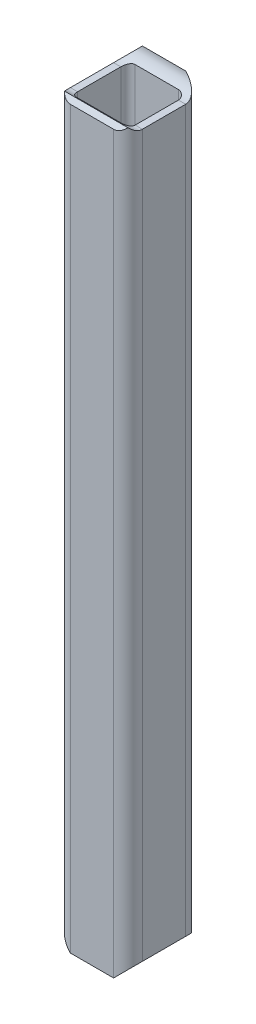
ISO-10303-21;
HEADER;
FILE_DESCRIPTION(('STEP AP214'),'2;1');
FILE_NAME('part.step','',(''),(''),'','','');
FILE_SCHEMA(('AUTOMOTIVE_DESIGN { 1 0 10303 214 1 1 1 1 }'));
ENDSEC;
DATA;
#1=APPLICATION_CONTEXT('core data for automotive mechanical design processes');
#2=APPLICATION_PROTOCOL_DEFINITION('international standard','automotive_design',2000,#1);
#3=PRODUCT_CONTEXT('',#1,'mechanical');
#4=PRODUCT('Part','Part','',(#3));
#5=PRODUCT_RELATED_PRODUCT_CATEGORY('part','',(#4));
#6=PRODUCT_DEFINITION_FORMATION('','',#4);
#7=PRODUCT_DEFINITION_CONTEXT('part definition',#1,'design');
#8=PRODUCT_DEFINITION('design','',#6,#7);
#9=PRODUCT_DEFINITION_SHAPE('','',#8);
#10=(LENGTH_UNIT() NAMED_UNIT(*) SI_UNIT(.MILLI.,.METRE.));
#11=(NAMED_UNIT(*) PLANE_ANGLE_UNIT() SI_UNIT($,.RADIAN.));
#12=(NAMED_UNIT(*) SI_UNIT($,.STERADIAN.) SOLID_ANGLE_UNIT());
#13=UNCERTAINTY_MEASURE_WITH_UNIT(LENGTH_MEASURE(1.E-05),#10,'distance_accuracy_value','');
#14=(GEOMETRIC_REPRESENTATION_CONTEXT(3) GLOBAL_UNCERTAINTY_ASSIGNED_CONTEXT((#13)) GLOBAL_UNIT_ASSIGNED_CONTEXT((#10,
#11,#12)) REPRESENTATION_CONTEXT('',''));
#15=CARTESIAN_POINT('',(0.,0.,0.));
#16=DIRECTION('',(0.,0.,1.));
#17=DIRECTION('',(1.,0.,0.));
#18=AXIS2_PLACEMENT_3D('',#15,#16,#17);
#19=CARTESIAN_POINT('',(5.99999999999992,1.94289029309402E-13,-2294.));
#20=DIRECTION('',(0.,1.,0.));
#21=DIRECTION('',(-1.,0.,0.));
#22=AXIS2_PLACEMENT_3D('',#19,#20,#21);
#23=CYLINDRICAL_SURFACE('',#22,4.);
#24=CARTESIAN_POINT('',(5.99999999999995,214.,-2294.));
#25=DIRECTION('',(0.707106781186548,0.707106781186547,0.));
#26=DIRECTION('',(-0.707106781186547,0.707106781186548,0.));
#27=AXIS2_PLACEMENT_3D('',#24,#25,#26);
#28=ELLIPSE('',#27,5.65685424949238,4.);
#29=CARTESIAN_POINT('',(8.82842712474652,211.171572875254,-2291.17157287525));
#30=VERTEX_POINT('',#29);
#31=CARTESIAN_POINT('',(9.99999999999995,210.,-2294.));
#32=VERTEX_POINT('',#31);
#33=EDGE_CURVE('E119',#30,#32,#28,.T.);
#34=ORIENTED_EDGE('',*,*,#33,.F.);
#35=CARTESIAN_POINT('',(5.99999999999995,214.,-2294.));
#36=DIRECTION('',(0.,0.707106781186548,0.707106781186548));
#37=DIRECTION('',(0.,0.707106781186548,-0.707106781186548));
#38=AXIS2_PLACEMENT_3D('',#35,#36,#37);
#39=ELLIPSE('',#38,5.65685424949238,4.);
#40=CARTESIAN_POINT('',(5.99999999999995,210.,-2290.));
#41=VERTEX_POINT('',#40);
#42=EDGE_CURVE('E173',#41,#30,#39,.T.);
#43=ORIENTED_EDGE('',*,*,#42,.F.);
#44=DIRECTION('',(0.,1.,0.));
#45=VECTOR('',#44,1.);
#46=CARTESIAN_POINT('',(5.99999999999992,1.94289029309402E-13,-2290.));
#47=LINE('',#46,#45);
#48=CARTESIAN_POINT('',(5.99999999999987,6.00000000000001,-2290.));
#49=VERTEX_POINT('',#48);
#50=EDGE_CURVE('E139',#49,#41,#47,.T.);
#51=ORIENTED_EDGE('',*,*,#50,.F.);
#52=CARTESIAN_POINT('',(5.99999999999992,6.00000000000001,-2294.));
#53=DIRECTION('',(-0.707106781186547,0.707106781186548,0.));
#54=DIRECTION('',(0.707106781186548,0.707106781186547,0.));
#55=AXIS2_PLACEMENT_3D('',#52,#53,#54);
#56=ELLIPSE('',#55,5.65685424949239,4.);
#57=CARTESIAN_POINT('',(9.99999999999993,10.,-2294.));
#58=VERTEX_POINT('',#57);
#59=EDGE_CURVE('E182',#58,#49,#56,.F.);
#60=ORIENTED_EDGE('',*,*,#59,.F.);
#61=DIRECTION('',(0.,1.,0.));
#62=VECTOR('',#61,1.);
#63=CARTESIAN_POINT('',(9.99999999999993,1.94289029309402E-13,-2294.));
#64=LINE('',#63,#62);
#65=EDGE_CURVE('E345',#58,#32,#64,.T.);
#66=ORIENTED_EDGE('',*,*,#65,.T.);
#67=EDGE_LOOP('',(#34,#43,#51,#60,#66));
#68=FACE_BOUND('',#67,.T.);
#69=ADVANCED_FACE('F41',(#68),#23,.T.);
#70=CARTESIAN_POINT('',(-6.00000000000006,1.94289029309402E-13,-2294.));
#71=DIRECTION('',(0.,1.,0.));
#72=DIRECTION('',(-1.,0.,0.));
#73=AXIS2_PLACEMENT_3D('',#70,#71,#72);
#74=CYLINDRICAL_SURFACE('',#73,4.);
#75=CARTESIAN_POINT('',(-6.00000000000005,214.,-2294.));
#76=DIRECTION('',(-0.707106781186547,0.707106781186548,0.));
#77=DIRECTION('',(0.707106781186548,0.707106781186547,0.));
#78=AXIS2_PLACEMENT_3D('',#75,#76,#77);
#79=ELLIPSE('',#78,5.65685424949239,4.);
#80=CARTESIAN_POINT('',(-10.0000000000001,210.,-2294.));
#81=VERTEX_POINT('',#80);
#82=CARTESIAN_POINT('',(-8.82842712474652,211.171572875254,-2291.17157287525));
#83=VERTEX_POINT('',#82);
#84=EDGE_CURVE('E440',#81,#83,#79,.T.);
#85=ORIENTED_EDGE('',*,*,#84,.F.);
#86=DIRECTION('',(0.,1.,0.));
#87=VECTOR('',#86,1.);
#88=CARTESIAN_POINT('',(-10.0000000000001,1.94289029309402E-13,-2294.));
#89=LINE('',#88,#87);
#90=CARTESIAN_POINT('',(-10.0000000000001,10.,-2294.));
#91=VERTEX_POINT('',#90);
#92=EDGE_CURVE('E136',#91,#81,#89,.T.);
#93=ORIENTED_EDGE('',*,*,#92,.F.);
#94=CARTESIAN_POINT('',(-6.00000000000006,6.00000000000001,-2294.));
#95=DIRECTION('',(0.707106781186548,0.707106781186547,0.));
#96=DIRECTION('',(-0.707106781186547,0.707106781186548,0.));
#97=AXIS2_PLACEMENT_3D('',#94,#95,#96);
#98=ELLIPSE('',#97,5.65685424949238,4.);
#99=CARTESIAN_POINT('',(-6.00000000000006,6.00000000000001,-2290.));
#100=VERTEX_POINT('',#99);
#101=EDGE_CURVE('E185',#100,#91,#98,.F.);
#102=ORIENTED_EDGE('',*,*,#101,.F.);
#103=DIRECTION('',(0.,1.,0.));
#104=VECTOR('',#103,1.);
#105=CARTESIAN_POINT('',(-6.00000000000006,1.94289029309402E-13,-2290.));
#106=LINE('',#105,#104);
#107=CARTESIAN_POINT('',(-6.00000000000003,210.,-2290.));
#108=VERTEX_POINT('',#107);
#109=EDGE_CURVE('E360',#100,#108,#106,.T.);
#110=ORIENTED_EDGE('',*,*,#109,.T.);
#111=CARTESIAN_POINT('',(-6.00000000000003,214.,-2294.));
#112=DIRECTION('',(0.,0.707106781186548,0.707106781186548));
#113=DIRECTION('',(0.,0.707106781186548,-0.707106781186548));
#114=AXIS2_PLACEMENT_3D('',#111,#112,#113);
#115=ELLIPSE('',#114,5.65685424949238,4.);
#116=EDGE_CURVE('E165',#83,#108,#115,.T.);
#117=ORIENTED_EDGE('',*,*,#116,.F.);
#118=EDGE_LOOP('',(#85,#93,#102,#110,#117));
#119=FACE_BOUND('',#118,.T.);
#120=ADVANCED_FACE('F445',(#119),#74,.T.);
#121=CARTESIAN_POINT('',(-6.00000000000006,1.94289029309402E-13,-2306.));
#122=DIRECTION('',(0.,1.,0.));
#123=DIRECTION('',(-1.,0.,0.));
#124=AXIS2_PLACEMENT_3D('',#121,#122,#123);
#125=CYLINDRICAL_SURFACE('',#124,4.);
#126=CARTESIAN_POINT('',(-6.00000000000005,214.,-2306.));
#127=DIRECTION('',(-0.707106781186547,0.707106781186548,0.));
#128=DIRECTION('',(0.707106781186548,0.707106781186547,0.));
#129=AXIS2_PLACEMENT_3D('',#126,#127,#128);
#130=ELLIPSE('',#129,5.65685424949239,4.);
#131=CARTESIAN_POINT('',(-6.00000000000006,214.,-2310.));
#132=VERTEX_POINT('',#131);
#133=CARTESIAN_POINT('',(-10.,210.,-2306.));
#134=VERTEX_POINT('',#133);
#135=EDGE_CURVE('E320',#132,#134,#130,.T.);
#136=ORIENTED_EDGE('',*,*,#135,.F.);
#137=DIRECTION('',(0.,1.,0.));
#138=VECTOR('',#137,1.);
#139=CARTESIAN_POINT('',(-6.00000000000006,1.94289029309402E-13,-2310.));
#140=LINE('',#139,#138);
#141=CARTESIAN_POINT('',(-6.00000000000012,6.00000000000001,-2310.));
#142=VERTEX_POINT('',#141);
#143=EDGE_CURVE('E163',#142,#132,#140,.T.);
#144=ORIENTED_EDGE('',*,*,#143,.F.);
#145=CARTESIAN_POINT('',(-6.00000000000006,6.00000000000001,-2306.));
#146=DIRECTION('',(0.707106781186548,0.707106781186547,0.));
#147=DIRECTION('',(-0.707106781186547,0.707106781186548,0.));
#148=AXIS2_PLACEMENT_3D('',#145,#146,#147);
#149=ELLIPSE('',#148,5.65685424949238,4.);
#150=CARTESIAN_POINT('',(-10.0000000000001,10.,-2306.));
#151=VERTEX_POINT('',#150);
#152=EDGE_CURVE('E180',#151,#142,#149,.F.);
#153=ORIENTED_EDGE('',*,*,#152,.F.);
#154=DIRECTION('',(0.,1.,0.));
#155=VECTOR('',#154,1.);
#156=CARTESIAN_POINT('',(-10.0000000000001,1.94289029309402E-13,-2306.));
#157=LINE('',#156,#155);
#158=EDGE_CURVE('E364',#151,#134,#157,.T.);
#159=ORIENTED_EDGE('',*,*,#158,.T.);
#160=EDGE_LOOP('',(#136,#144,#153,#159));
#161=FACE_BOUND('',#160,.T.);
#162=ADVANCED_FACE('F43',(#161),#125,.T.);
#163=CARTESIAN_POINT('',(5.99999999999998,1.94289029309402E-13,-2306.));
#164=DIRECTION('',(0.,1.,0.));
#165=DIRECTION('',(-1.,0.,0.));
#166=AXIS2_PLACEMENT_3D('',#163,#164,#165);
#167=CYLINDRICAL_SURFACE('',#166,4.);
#168=CARTESIAN_POINT('',(6.00000000000001,214.,-2306.));
#169=DIRECTION('',(0.707106781186548,0.707106781186547,0.));
#170=DIRECTION('',(-0.707106781186547,0.707106781186548,0.));
#171=AXIS2_PLACEMENT_3D('',#168,#169,#170);
#172=ELLIPSE('',#171,5.65685424949238,4.);
#173=CARTESIAN_POINT('',(9.99999999999995,210.,-2306.));
#174=VERTEX_POINT('',#173);
#175=CARTESIAN_POINT('',(6.00000000000001,214.,-2310.));
#176=VERTEX_POINT('',#175);
#177=EDGE_CURVE('E283',#174,#176,#172,.T.);
#178=ORIENTED_EDGE('',*,*,#177,.F.);
#179=DIRECTION('',(0.,1.,0.));
#180=VECTOR('',#179,1.);
#181=CARTESIAN_POINT('',(9.99999999999998,1.94289029309402E-13,-2306.));
#182=LINE('',#181,#180);
#183=CARTESIAN_POINT('',(9.99999999999993,10.,-2306.));
#184=VERTEX_POINT('',#183);
#185=EDGE_CURVE('E160',#184,#174,#182,.T.);
#186=ORIENTED_EDGE('',*,*,#185,.F.);
#187=CARTESIAN_POINT('',(5.99999999999998,6.00000000000001,-2306.));
#188=DIRECTION('',(-0.707106781186547,0.707106781186548,0.));
#189=DIRECTION('',(0.707106781186548,0.707106781186547,0.));
#190=AXIS2_PLACEMENT_3D('',#187,#188,#189);
#191=ELLIPSE('',#190,5.65685424949239,4.);
#192=CARTESIAN_POINT('',(5.99999999999998,6.00000000000001,-2310.));
#193=VERTEX_POINT('',#192);
#194=EDGE_CURVE('E298',#193,#184,#191,.F.);
#195=ORIENTED_EDGE('',*,*,#194,.F.);
#196=DIRECTION('',(0.,1.,0.));
#197=VECTOR('',#196,1.);
#198=CARTESIAN_POINT('',(5.99999999999998,1.94289029309402E-13,-2310.));
#199=LINE('',#198,#197);
#200=EDGE_CURVE('E45',#193,#176,#199,.T.);
#201=ORIENTED_EDGE('',*,*,#200,.T.);
#202=EDGE_LOOP('',(#178,#186,#195,#201));
#203=FACE_BOUND('',#202,.T.);
#204=ADVANCED_FACE('F349',(#203),#167,.T.);
#205=CARTESIAN_POINT('',(-6.00000000000006,1.94289029309402E-13,-2294.));
#206=DIRECTION('',(0.,1.,0.));
#207=DIRECTION('',(-1.,0.,0.));
#208=AXIS2_PLACEMENT_3D('',#205,#206,#207);
#209=CYLINDRICAL_SURFACE('',#208,2.);
#210=DIRECTION('',(0.,1.,0.));
#211=VECTOR('',#210,1.);
#212=CARTESIAN_POINT('',(-8.00000000000006,1.94289029309402E-13,-2294.));
#213=LINE('',#212,#211);
#214=CARTESIAN_POINT('',(-8.00000000000006,10.,-2294.));
#215=VERTEX_POINT('',#214);
#216=CARTESIAN_POINT('',(-8.00000000000004,210.,-2294.));
#217=VERTEX_POINT('',#216);
#218=EDGE_CURVE('E259',#215,#217,#213,.T.);
#219=ORIENTED_EDGE('',*,*,#218,.T.);
#220=CARTESIAN_POINT('',(-8.00000000000004,210.,-2294.));
#221=CARTESIAN_POINT('',(-8.00000848506605,209.999990627617,-2293.94720265964));
#222=CARTESIAN_POINT('',(-7.99790957026023,210.001045085879,-2293.89441132621));
#223=CARTESIAN_POINT('',(-7.98956283651242,210.005211347836,-2293.78926002691));
#224=CARTESIAN_POINT('',(-7.98331668420862,210.008322325081,-2293.7368998963));
#225=CARTESIAN_POINT('',(-7.96677918947506,210.016512635667,-2293.63322500214));
#226=CARTESIAN_POINT('',(-7.95650648410167,210.02158289887,-2293.58190655203));
#227=CARTESIAN_POINT('',(-7.93204223131386,210.033556428193,-2293.48044271966));
#228=CARTESIAN_POINT('',(-7.91785044137551,210.04045980775,-2293.43029741022));
#229=CARTESIAN_POINT('',(-7.86964369116306,210.063661505691,-2293.2822451259));
#230=CARTESIAN_POINT('',(-7.82996241203586,210.082469396681,-2293.18650677958));
#231=CARTESIAN_POINT('',(-7.7369134305905,210.125059667261,-2293.0031350272));
#232=CARTESIAN_POINT('',(-7.68353190765247,210.148847065615,-2292.91550992784));
#233=CARTESIAN_POINT('',(-7.56096814283082,210.200873856,-2292.74499097179));
#234=CARTESIAN_POINT('',(-7.49103103000848,210.22929456303,-2292.66269482125));
#235=CARTESIAN_POINT('',(-7.33896043757014,210.286799257121,-2292.51044325876));
#236=CARTESIAN_POINT('',(-7.25681716529678,210.315883760723,-2292.44049785499));
#237=CARTESIAN_POINT('',(-7.07496660763718,210.374042776885,-2292.30944751094));
#238=CARTESIAN_POINT('',(-6.97438766418385,210.402938186256,-2292.24946363689));
#239=CARTESIAN_POINT('',(-6.76309931354656,210.454312993058,-2292.14760156324));
#240=CARTESIAN_POINT('',(-6.65241223109046,210.476806098578,-2292.10568457974));
#241=CARTESIAN_POINT('',(-6.45145248032494,210.507655701794,-2292.0495396522));
#242=CARTESIAN_POINT('',(-6.36268650425014,210.518112474633,-2292.03107374171));
#243=CARTESIAN_POINT('',(-6.22776613186865,210.528710997531,-2292.01248910907));
#244=CARTESIAN_POINT('',(-6.18240073628846,210.531396317696,-2292.00781310235));
#245=CARTESIAN_POINT('',(-6.09136258399694,210.534993774356,-2292.00156618814));
#246=CARTESIAN_POINT('',(-6.04568967449565,210.53590495225,-2291.9999969593));
#247=CARTESIAN_POINT('',(-6.00000000000008,210.535898384862,-2292.));
#248=B_SPLINE_CURVE_WITH_KNOTS('',3,(#220,#221,#222,#223,#224,#225,#226,#227,#228,#229,#230,
#231,#232,#233,#234,#235,#236,#237,#238,#239,#240,#241,#242,#243,#244,#245,#246,#247),
.UNSPECIFIED.,.F.,.F.,(4,2,2,2,2,2,2,2,2,2,2,2,2,4),(0.,0.158329806863169,0.316596024669427,
0.474138190899981,0.631690108466985,0.94614650035058,1.26092136705979,1.59454928426021,
1.92844632145553,2.28848800862824,2.64775290324107,2.92045951053463,3.05738651447678,
3.19438748205596),.UNSPECIFIED.);
#249=CARTESIAN_POINT('',(-6.00000000000023,210.535898384862,-2292.));
#250=VERTEX_POINT('',#249);
#251=EDGE_CURVE('E200',#217,#250,#248,.T.);
#252=ORIENTED_EDGE('',*,*,#251,.T.);
#253=DIRECTION('',(0.,1.,0.));
#254=VECTOR('',#253,1.);
#255=CARTESIAN_POINT('',(-6.00000000000006,1.94289029309402E-13,-2292.));
#256=LINE('',#255,#254);
#257=CARTESIAN_POINT('',(-6.0000000000002,9.46410161513789,-2292.));
#258=VERTEX_POINT('',#257);
#259=EDGE_CURVE('E199',#258,#250,#256,.T.);
#260=ORIENTED_EDGE('',*,*,#259,.F.);
#261=CARTESIAN_POINT('',(-6.00000000000006,9.46410161513789,-2292.));
#262=CARTESIAN_POINT('',(-6.05238014858583,9.46408620689721,-2291.99999055925));
#263=CARTESIAN_POINT('',(-6.10475173750406,9.46528926947159,-2292.00205743399));
#264=CARTESIAN_POINT('',(-6.20903746023229,9.47001632039852,-2292.01026951613));
#265=CARTESIAN_POINT('',(-6.26095185532725,9.47353888235471,-2292.01641221709));
#266=CARTESIAN_POINT('',(-6.3636487620485,9.48276228461818,-2292.03265445811));
#267=CARTESIAN_POINT('',(-6.41443610009715,9.48845033927113,-2292.04273078172));
#268=CARTESIAN_POINT('',(-6.51482628147642,9.50179490521518,-2292.06670737878));
#269=CARTESIAN_POINT('',(-6.56442898812652,9.50945164246142,-2292.0806080912));
#270=CARTESIAN_POINT('',(-6.71076917247365,9.53496935658959,-2292.12776182526));
#271=CARTESIAN_POINT('',(-6.80534715410667,9.55540800132124,-2292.16651628421));
#272=CARTESIAN_POINT('',(-6.98672989575566,9.60081586380203,-2292.25738808538));
#273=CARTESIAN_POINT('',(-7.07352198797484,9.62579227179902,-2292.30952669019));
#274=CARTESIAN_POINT('',(-7.24461525249188,9.67993971872857,-2292.43067175637));
#275=CARTESIAN_POINT('',(-7.32813282894903,9.70928674935266,-2292.50070868253));
#276=CARTESIAN_POINT('',(-7.48283156094596,9.76744521029291,-2292.65350861268));
#277=CARTESIAN_POINT('',(-7.55400890931994,9.79625647287695,-2292.73627552928));
#278=CARTESIAN_POINT('',(-7.68676537546052,9.85244289331698,-2292.91906332013));
#279=CARTESIAN_POINT('',(-7.74736267433222,9.87958716856415,-2293.01987475401));
#280=CARTESIAN_POINT('',(-7.85032202135317,9.92703407230318,-2293.23179320242));
#281=CARTESIAN_POINT('',(-7.89271226962714,9.94734727048882,-2293.34288396895));
#282=CARTESIAN_POINT('',(-7.94968116248633,9.97502213875322,-2293.54500219639));
#283=CARTESIAN_POINT('',(-7.96845962320438,9.98430781773861,-2293.63458867955));
#284=CARTESIAN_POINT('',(-7.98733474672559,9.99367902763974,-2293.7706327079));
#285=CARTESIAN_POINT('',(-7.99207779704417,9.99604332168123,-2293.81632873879));
#286=CARTESIAN_POINT('',(-7.99841234175519,9.99920598971059,-2293.9080112283));
#287=CARTESIAN_POINT('',(-8.00000253913833,10.0000037192495,-2293.95399779865));
#288=CARTESIAN_POINT('',(-8.00000000000006,10.,-2294.));
#289=B_SPLINE_CURVE_WITH_KNOTS('',3,(#261,#262,#263,#264,#265,#266,#267,#268,#269,#270,#271,
#272,#273,#274,#275,#276,#277,#278,#279,#280,#281,#282,#283,#284,#285,#286,#287,#288),
.UNSPECIFIED.,.F.,.F.,(4,2,2,2,2,2,2,2,2,2,2,2,2,4),(0.,0.157071840937238,0.314047179273227,
0.470109716412874,0.626190173600528,0.937421271464395,1.24914989675569,1.58636095727858,
1.92367586860978,2.28392845907402,2.64362103970006,2.91855292168888,3.05643812246984,
3.19438003420911),.UNSPECIFIED.);
#290=EDGE_CURVE('E190',#258,#215,#289,.T.);
#291=ORIENTED_EDGE('',*,*,#290,.T.);
#292=EDGE_LOOP('',(#219,#252,#260,#291));
#293=FACE_BOUND('',#292,.T.);
#294=ADVANCED_FACE('F203',(#293),#209,.F.);
#295=CARTESIAN_POINT('',(5.99999999999992,1.94289029309402E-13,-2292.));
#296=DIRECTION('',(0.,0.,-1.));
#297=DIRECTION('',(-1.,0.,0.));
#298=AXIS2_PLACEMENT_3D('',#295,#296,#297);
#299=PLANE('',#298);
#300=ORIENTED_EDGE('',*,*,#259,.T.);
#301=DIRECTION('',(-1.,0.,0.));
#302=VECTOR('',#301,1.);
#303=CARTESIAN_POINT('',(250.,210.535898384862,-2292.));
#304=LINE('',#303,#302);
#305=CARTESIAN_POINT('',(5.99999999999995,210.535898384862,-2292.));
#306=VERTEX_POINT('',#305);
#307=EDGE_CURVE('E241',#250,#306,#304,.F.);
#308=ORIENTED_EDGE('',*,*,#307,.T.);
#309=DIRECTION('',(0.,1.,0.));
#310=VECTOR('',#309,1.);
#311=CARTESIAN_POINT('',(5.99999999999992,1.94289029309402E-13,-2292.));
#312=LINE('',#311,#310);
#313=CARTESIAN_POINT('',(5.99999999999992,9.46410161513789,-2292.));
#314=VERTEX_POINT('',#313);
#315=EDGE_CURVE('E130',#314,#306,#312,.T.);
#316=ORIENTED_EDGE('',*,*,#315,.F.);
#317=DIRECTION('',(1.,0.,0.));
#318=VECTOR('',#317,1.);
#319=CARTESIAN_POINT('',(-175.,9.46410161513789,-2292.));
#320=LINE('',#319,#318);
#321=EDGE_CURVE('E201',#314,#258,#320,.F.);
#322=ORIENTED_EDGE('',*,*,#321,.T.);
#323=EDGE_LOOP('',(#300,#308,#316,#322));
#324=FACE_BOUND('',#323,.T.);
#325=ADVANCED_FACE('F231',(#324),#299,.T.);
#326=CARTESIAN_POINT('',(5.99999999999992,1.94289029309402E-13,-2294.));
#327=DIRECTION('',(0.,1.,0.));
#328=DIRECTION('',(-1.,0.,0.));
#329=AXIS2_PLACEMENT_3D('',#326,#327,#328);
#330=CYLINDRICAL_SURFACE('',#329,2.);
#331=ORIENTED_EDGE('',*,*,#315,.T.);
#332=CARTESIAN_POINT('',(5.99999999999995,210.535898384862,-2292.));
#333=CARTESIAN_POINT('',(6.05238014858573,210.535913793103,-2291.99999055925));
#334=CARTESIAN_POINT('',(6.10475173750397,210.534710730529,-2292.00205743399));
#335=CARTESIAN_POINT('',(6.20903746023222,210.529983679602,-2292.01026951613));
#336=CARTESIAN_POINT('',(6.26095185532719,210.526461117646,-2292.01641221709));
#337=CARTESIAN_POINT('',(6.36364876204843,210.517237715382,-2292.03265445811));
#338=CARTESIAN_POINT('',(6.41443610009707,210.511549660729,-2292.04273078172));
#339=CARTESIAN_POINT('',(6.51482628147631,210.498205094785,-2292.06670737878));
#340=CARTESIAN_POINT('',(6.5644289881264,210.490548357539,-2292.0806080912));
#341=CARTESIAN_POINT('',(6.71076917247351,210.465030643411,-2292.12776182526));
#342=CARTESIAN_POINT('',(6.80534715410653,210.444591998679,-2292.16651628421));
#343=CARTESIAN_POINT('',(6.98672989575548,210.399184136198,-2292.25738808538));
#344=CARTESIAN_POINT('',(7.07352198797462,210.374207728201,-2292.30952669019));
#345=CARTESIAN_POINT('',(7.24461525249167,210.320060281272,-2292.43067175637));
#346=CARTESIAN_POINT('',(7.32813282894887,210.290713250648,-2292.50070868253));
#347=CARTESIAN_POINT('',(7.4828315609458,210.232554789707,-2292.65350861268));
#348=CARTESIAN_POINT('',(7.55400890931974,210.203743527123,-2292.73627552928));
#349=CARTESIAN_POINT('',(7.68676537546033,210.147557106683,-2292.91906332013));
#350=CARTESIAN_POINT('',(7.74736267433209,210.120412831436,-2293.01987475401));
#351=CARTESIAN_POINT('',(7.85032202135308,210.072965927697,-2293.23179320242));
#352=CARTESIAN_POINT('',(7.89271226962703,210.052652729511,-2293.34288396895));
#353=CARTESIAN_POINT('',(7.94968116248621,210.024977861247,-2293.54500219639));
#354=CARTESIAN_POINT('',(7.96845962320427,210.015692182261,-2293.63458867955));
#355=CARTESIAN_POINT('',(7.98733474672548,210.00632097236,-2293.7706327079));
#356=CARTESIAN_POINT('',(7.99207779704406,210.003956678319,-2293.81632873879));
#357=CARTESIAN_POINT('',(7.99841234175508,210.000794010289,-2293.9080112283));
#358=CARTESIAN_POINT('',(8.00000253913822,209.99999628075,-2293.95399779865));
#359=CARTESIAN_POINT('',(7.99999999999995,210.,-2294.));
#360=B_SPLINE_CURVE_WITH_KNOTS('',3,(#332,#333,#334,#335,#336,#337,#338,#339,#340,#341,#342,
#343,#344,#345,#346,#347,#348,#349,#350,#351,#352,#353,#354,#355,#356,#357,#358,#359),
.UNSPECIFIED.,.F.,.F.,(4,2,2,2,2,2,2,2,2,2,2,2,2,4),(0.,0.157071840937271,0.314047179273286,
0.47010971641289,0.626190173600504,0.937421271464356,1.24914989675559,1.58636095727855,
1.92367586860973,2.28392845907403,2.64362103970008,2.91855292168889,3.05643812246985,
3.19438003420913),.UNSPECIFIED.);
#361=CARTESIAN_POINT('',(7.99999999999995,210.,-2294.));
#362=VERTEX_POINT('',#361);
#363=EDGE_CURVE('E116',#306,#362,#360,.T.);
#364=ORIENTED_EDGE('',*,*,#363,.T.);
#365=DIRECTION('',(0.,1.,0.));
#366=VECTOR('',#365,1.);
#367=CARTESIAN_POINT('',(7.99999999999992,1.94289029309402E-13,-2294.));
#368=LINE('',#367,#366);
#369=CARTESIAN_POINT('',(7.99999999999992,10.,-2294.));
#370=VERTEX_POINT('',#369);
#371=EDGE_CURVE('E109',#370,#362,#368,.T.);
#372=ORIENTED_EDGE('',*,*,#371,.F.);
#373=CARTESIAN_POINT('',(7.99999999999992,10.,-2294.));
#374=CARTESIAN_POINT('',(8.00000848506594,10.0000093723835,-2293.94720265964));
#375=CARTESIAN_POINT('',(7.99790957026012,9.99895491412108,-2293.89441132621));
#376=CARTESIAN_POINT('',(7.9895628365123,9.99478865216411,-2293.78926002691));
#377=CARTESIAN_POINT('',(7.9833166842085,9.991677674919,-2293.7368998963));
#378=CARTESIAN_POINT('',(7.96677918947495,9.98348736433344,-2293.63322500214));
#379=CARTESIAN_POINT('',(7.95650648410156,9.97841710113027,-2293.58190655203));
#380=CARTESIAN_POINT('',(7.93204223131375,9.96644357180701,-2293.48044271966));
#381=CARTESIAN_POINT('',(7.9178504413754,9.95954019224955,-2293.43029741022));
#382=CARTESIAN_POINT('',(7.86964369116295,9.93633849430909,-2293.2822451259));
#383=CARTESIAN_POINT('',(7.82996241203575,9.9175306033188,-2293.18650677958));
#384=CARTESIAN_POINT('',(7.73691343059039,9.87494033273958,-2293.0031350272));
#385=CARTESIAN_POINT('',(7.68353190765237,9.85115293438478,-2292.91550992784));
#386=CARTESIAN_POINT('',(7.56096814283071,9.79912614399981,-2292.74499097179));
#387=CARTESIAN_POINT('',(7.49103103000836,9.77070543696984,-2292.66269482125));
#388=CARTESIAN_POINT('',(7.33896043757002,9.71320074287874,-2292.51044325876));
#389=CARTESIAN_POINT('',(7.25681716529667,9.68411623927747,-2292.44049785499));
#390=CARTESIAN_POINT('',(7.07496660763707,9.62595722311524,-2292.30944751094));
#391=CARTESIAN_POINT('',(6.97438766418373,9.59706181374404,-2292.24946363689));
#392=CARTESIAN_POINT('',(6.76309931354645,9.54568700694202,-2292.14760156324));
#393=CARTESIAN_POINT('',(6.65241223109036,9.52319390142219,-2292.10568457974));
#394=CARTESIAN_POINT('',(6.45145248032484,9.49234429820579,-2292.0495396522));
#395=CARTESIAN_POINT('',(6.36268650425004,9.48188752536724,-2292.03107374171));
#396=CARTESIAN_POINT('',(6.22776613186854,9.47128900246916,-2292.01248910907));
#397=CARTESIAN_POINT('',(6.18240073628835,9.46860368230452,-2292.00781310235));
#398=CARTESIAN_POINT('',(6.09136258399683,9.46500622564436,-2292.00156618814));
#399=CARTESIAN_POINT('',(6.04568967449554,9.46409504775012,-2291.9999969593));
#400=CARTESIAN_POINT('',(5.99999999999997,9.46410161513776,-2292.));
#401=B_SPLINE_CURVE_WITH_KNOTS('',3,(#373,#374,#375,#376,#377,#378,#379,#380,#381,#382,#383,
#384,#385,#386,#387,#388,#389,#390,#391,#392,#393,#394,#395,#396,#397,#398,#399,#400),
.UNSPECIFIED.,.F.,.F.,(4,2,2,2,2,2,2,2,2,2,2,2,2,4),(0.,0.158329806863169,0.316596024669425,
0.474138190899978,0.63169010846698,0.946146500350569,1.26092136705977,1.59454928426018,
1.92844632145549,2.2884880086282,2.64775290324102,2.92045951053458,3.05738651447674,
3.19438748205591),.UNSPECIFIED.);
#402=EDGE_CURVE('E131',#370,#314,#401,.T.);
#403=ORIENTED_EDGE('',*,*,#402,.T.);
#404=EDGE_LOOP('',(#331,#364,#372,#403));
#405=FACE_BOUND('',#404,.T.);
#406=ADVANCED_FACE('F126',(#405),#330,.F.);
#407=CARTESIAN_POINT('',(5.99999999999998,1.94289029309402E-13,-2306.));
#408=DIRECTION('',(0.,1.,0.));
#409=DIRECTION('',(-1.,0.,0.));
#410=AXIS2_PLACEMENT_3D('',#407,#408,#409);
#411=CYLINDRICAL_SURFACE('',#410,2.);
#412=DIRECTION('',(0.,1.,0.));
#413=VECTOR('',#412,1.);
#414=CARTESIAN_POINT('',(7.99999999999998,1.94289029309402E-13,-2306.));
#415=LINE('',#414,#413);
#416=CARTESIAN_POINT('',(7.99999999999998,10.,-2306.));
#417=VERTEX_POINT('',#416);
#418=CARTESIAN_POINT('',(8.00000000000001,210.,-2306.));
#419=VERTEX_POINT('',#418);
#420=EDGE_CURVE('E144',#417,#419,#415,.T.);
#421=ORIENTED_EDGE('',*,*,#420,.T.);
#422=CARTESIAN_POINT('',(8.00000000000001,210.,-2306.));
#423=CARTESIAN_POINT('',(8.00000848506602,209.999990627617,-2306.05279734036));
#424=CARTESIAN_POINT('',(7.99790957026019,210.001045085879,-2306.10558867379));
#425=CARTESIAN_POINT('',(7.98956283651234,210.005211347836,-2306.21073997309));
#426=CARTESIAN_POINT('',(7.98331668420853,210.008322325081,-2306.2631001037));
#427=CARTESIAN_POINT('',(7.96677918947495,210.016512635667,-2306.36677499786));
#428=CARTESIAN_POINT('',(7.95650648410155,210.02158289887,-2306.41809344797));
#429=CARTESIAN_POINT('',(7.93204223131375,210.033556428193,-2306.51955728034));
#430=CARTESIAN_POINT('',(7.91785044137544,210.04045980775,-2306.56970258978));
#431=CARTESIAN_POINT('',(7.86964369116302,210.063661505691,-2306.7177548741));
#432=CARTESIAN_POINT('',(7.82996241203583,210.082469396681,-2306.81349322042));
#433=CARTESIAN_POINT('',(7.73691343059047,210.12505966726,-2306.9968649728));
#434=CARTESIAN_POINT('',(7.68353190765245,210.148847065615,-2307.08449007216));
#435=CARTESIAN_POINT('',(7.56096814283079,210.200873856,-2307.25500902821));
#436=CARTESIAN_POINT('',(7.49103103000843,210.22929456303,-2307.33730517875));
#437=CARTESIAN_POINT('',(7.33896043757011,210.286799257121,-2307.48955674124));
#438=CARTESIAN_POINT('',(7.25681716529679,210.315883760722,-2307.55950214501));
#439=CARTESIAN_POINT('',(7.0749666076372,210.374042776885,-2307.69055248905));
#440=CARTESIAN_POINT('',(6.97438766418385,210.402938186256,-2307.75053636311));
#441=CARTESIAN_POINT('',(6.76309931354658,210.454312993058,-2307.85239843676));
#442=CARTESIAN_POINT('',(6.65241223109051,210.476806098578,-2307.89431542026));
#443=CARTESIAN_POINT('',(6.45145248032491,210.507655701794,-2307.9504603478));
#444=CARTESIAN_POINT('',(6.36268650425004,210.518112474632,-2307.96892625829));
#445=CARTESIAN_POINT('',(6.22776613186849,210.528710997531,-2307.98751089092));
#446=CARTESIAN_POINT('',(6.1824007362883,210.531396317695,-2307.99218689765));
#447=CARTESIAN_POINT('',(6.09136258399678,210.534993774355,-2307.99843381186));
#448=CARTESIAN_POINT('',(6.04568967449548,210.53590495225,-2308.0000030407));
#449=CARTESIAN_POINT('',(5.9999999999999,210.535898384862,-2308.));
#450=B_SPLINE_CURVE_WITH_KNOTS('',3,(#422,#423,#424,#425,#426,#427,#428,#429,#430,#431,#432,
#433,#434,#435,#436,#437,#438,#439,#440,#441,#442,#443,#444,#445,#446,#447,#448,#449),
.UNSPECIFIED.,.F.,.F.,(4,2,2,2,2,2,2,2,2,2,2,2,2,4),(0.,0.158329806863614,0.316596024669874,
0.474138190900435,0.631690108466976,0.946146500350562,1.26092136705976,1.59454928426016,
1.92844632145546,2.28848800862783,2.6477529032409,2.9204595105346,3.05738651447676,
3.19438748205596),.UNSPECIFIED.);
#451=CARTESIAN_POINT('',(6.00000000000001,210.535898384862,-2308.));
#452=VERTEX_POINT('',#451);
#453=EDGE_CURVE('E146',#419,#452,#450,.T.);
#454=ORIENTED_EDGE('',*,*,#453,.T.);
#455=DIRECTION('',(0.,1.,0.));
#456=VECTOR('',#455,1.);
#457=CARTESIAN_POINT('',(5.99999999999998,1.94289029309402E-13,-2308.));
#458=LINE('',#457,#456);
#459=CARTESIAN_POINT('',(6.00000000000001,9.46410161513789,-2308.));
#460=VERTEX_POINT('',#459);
#461=EDGE_CURVE('E147',#460,#452,#458,.T.);
#462=ORIENTED_EDGE('',*,*,#461,.F.);
#463=CARTESIAN_POINT('',(5.99999999999998,9.46410161513789,-2308.));
#464=CARTESIAN_POINT('',(6.05238014858574,9.46408620689738,-2308.00000944075));
#465=CARTESIAN_POINT('',(6.10475173750397,9.46528926947182,-2307.99794256601));
#466=CARTESIAN_POINT('',(6.20903746023222,9.4700163203988,-2307.98973048387));
#467=CARTESIAN_POINT('',(6.2609518553272,9.47353888235497,-2307.98358778291));
#468=CARTESIAN_POINT('',(6.36364876204846,9.48276228461842,-2307.96734554189));
#469=CARTESIAN_POINT('',(6.41443610009711,9.48845033927138,-2307.95726921828));
#470=CARTESIAN_POINT('',(6.51482628147636,9.50179490521543,-2307.93329262122));
#471=CARTESIAN_POINT('',(6.56442898812646,9.50945164246167,-2307.9193919088));
#472=CARTESIAN_POINT('',(6.7107691724736,9.53496935658984,-2307.87223817474));
#473=CARTESIAN_POINT('',(6.80534715410666,9.55540800132148,-2307.83348371579));
#474=CARTESIAN_POINT('',(6.98672989575567,9.60081586380226,-2307.74261191462));
#475=CARTESIAN_POINT('',(7.07352198797484,9.62579227179925,-2307.69047330981));
#476=CARTESIAN_POINT('',(7.24461525249196,9.67993971872882,-2307.56932824363));
#477=CARTESIAN_POINT('',(7.32813282894921,9.70928674935293,-2307.49929131747));
#478=CARTESIAN_POINT('',(7.48283156094618,9.76744521029319,-2307.34649138732));
#479=CARTESIAN_POINT('',(7.55400890932012,9.79625647287721,-2307.26372447072));
#480=CARTESIAN_POINT('',(7.68676537546077,9.85244289331724,-2307.08093667987));
#481=CARTESIAN_POINT('',(7.74736267433251,9.87958716856442,-2306.98012524599));
#482=CARTESIAN_POINT('',(7.85032202135329,9.92703407230336,-2306.76820679758));
#483=CARTESIAN_POINT('',(7.89271226962714,9.94734727048893,-2306.65711603105));
#484=CARTESIAN_POINT('',(7.94968116248613,9.97502213875321,-2306.45499780361));
#485=CARTESIAN_POINT('',(7.96845962320412,9.98430781773856,-2306.36541132045));
#486=CARTESIAN_POINT('',(7.98733474672536,9.99367902763968,-2306.2293672921));
#487=CARTESIAN_POINT('',(7.99207779704397,9.99604332168119,-2306.18367126121));
#488=CARTESIAN_POINT('',(7.99841234175506,9.99920598971057,-2306.0919887717));
#489=CARTESIAN_POINT('',(8.00000253913823,10.0000037192495,-2306.04600220135));
#490=CARTESIAN_POINT('',(7.99999999999998,10.,-2306.));
#491=B_SPLINE_CURVE_WITH_KNOTS('',3,(#463,#464,#465,#466,#467,#468,#469,#470,#471,#472,#473,
#474,#475,#476,#477,#478,#479,#480,#481,#482,#483,#484,#485,#486,#487,#488,#489,#490),
.UNSPECIFIED.,.F.,.F.,(4,2,2,2,2,2,2,2,2,2,2,2,2,4),(0.,0.157071840937247,0.314047179273303,
0.470109716412926,0.626190173600573,0.937421271464447,1.24914989675606,1.58636095727912,
1.92367586860985,2.28392845907498,2.64362103970002,2.91855292168749,3.05643812246846,
3.19438003420818),.UNSPECIFIED.);
#492=EDGE_CURVE('E151',#460,#417,#491,.T.);
#493=ORIENTED_EDGE('',*,*,#492,.T.);
#494=EDGE_LOOP('',(#421,#454,#462,#493));
#495=FACE_BOUND('',#494,.T.);
#496=ADVANCED_FACE('F230',(#495),#411,.F.);
#497=CARTESIAN_POINT('',(-6.00000000000006,1.94289029309402E-13,-2308.));
#498=DIRECTION('',(0.,0.,1.));
#499=DIRECTION('',(1.,0.,0.));
#500=AXIS2_PLACEMENT_3D('',#497,#498,#499);
#501=PLANE('',#500);
#502=ORIENTED_EDGE('',*,*,#461,.T.);
#503=DIRECTION('',(-1.,0.,0.));
#504=VECTOR('',#503,1.);
#505=CARTESIAN_POINT('',(250.,210.535898384862,-2308.));
#506=LINE('',#505,#504);
#507=CARTESIAN_POINT('',(-5.99999999999993,210.535898384862,-2308.));
#508=VERTEX_POINT('',#507);
#509=EDGE_CURVE('E150',#452,#508,#506,.T.);
#510=ORIENTED_EDGE('',*,*,#509,.T.);
#511=DIRECTION('',(0.,1.,0.));
#512=VECTOR('',#511,1.);
#513=CARTESIAN_POINT('',(-6.00000000000006,1.94289029309402E-13,-2308.));
#514=LINE('',#513,#512);
#515=CARTESIAN_POINT('',(-6.00000000000006,9.46410161513789,-2308.));
#516=VERTEX_POINT('',#515);
#517=EDGE_CURVE('E152',#516,#508,#514,.T.);
#518=ORIENTED_EDGE('',*,*,#517,.F.);
#519=DIRECTION('',(1.,0.,0.));
#520=VECTOR('',#519,1.);
#521=CARTESIAN_POINT('',(-175.,9.46410161513789,-2308.));
#522=LINE('',#521,#520);
#523=EDGE_CURVE('E156',#516,#460,#522,.T.);
#524=ORIENTED_EDGE('',*,*,#523,.T.);
#525=EDGE_LOOP('',(#502,#510,#518,#524));
#526=FACE_BOUND('',#525,.T.);
#527=ADVANCED_FACE('F287',(#526),#501,.T.);
#528=CARTESIAN_POINT('',(-6.00000000000006,1.94289029309402E-13,-2306.));
#529=DIRECTION('',(0.,1.,0.));
#530=DIRECTION('',(-1.,0.,0.));
#531=AXIS2_PLACEMENT_3D('',#528,#529,#530);
#532=CYLINDRICAL_SURFACE('',#531,2.);
#533=ORIENTED_EDGE('',*,*,#517,.T.);
#534=CARTESIAN_POINT('',(-5.99999999999993,210.535898384862,-2308.));
#535=CARTESIAN_POINT('',(-6.05238014858569,210.535913793103,-2308.00000944075));
#536=CARTESIAN_POINT('',(-6.1047517375039,210.534710730528,-2307.99794256601));
#537=CARTESIAN_POINT('',(-6.20903746023212,210.529983679601,-2307.98973048387));
#538=CARTESIAN_POINT('',(-6.2609518553271,210.526461117645,-2307.98358778291));
#539=CARTESIAN_POINT('',(-6.36364876204837,210.517237715382,-2307.96734554189));
#540=CARTESIAN_POINT('',(-6.41443610009702,210.511549660729,-2307.95726921828));
#541=CARTESIAN_POINT('',(-6.5148262814763,210.498205094785,-2307.93329262122));
#542=CARTESIAN_POINT('',(-6.5644289881264,210.490548357538,-2307.9193919088));
#543=CARTESIAN_POINT('',(-6.71076917247354,210.46503064341,-2307.87223817474));
#544=CARTESIAN_POINT('',(-6.80534715410657,210.444591998679,-2307.83348371579));
#545=CARTESIAN_POINT('',(-6.98672989575554,210.399184136198,-2307.74261191462));
#546=CARTESIAN_POINT('',(-7.07352198797469,210.374207728201,-2307.69047330981));
#547=CARTESIAN_POINT('',(-7.24461525249175,210.320060281271,-2307.56932824363));
#548=CARTESIAN_POINT('',(-7.32813282894895,210.290713250647,-2307.49929131747));
#549=CARTESIAN_POINT('',(-7.48283156094593,210.232554789707,-2307.34649138732));
#550=CARTESIAN_POINT('',(-7.5540089093199,210.203743527123,-2307.26372447072));
#551=CARTESIAN_POINT('',(-7.68676537546057,210.147557106683,-2307.08093667987));
#552=CARTESIAN_POINT('',(-7.74736267433235,210.120412831436,-2306.98012524599));
#553=CARTESIAN_POINT('',(-7.85032202135326,210.072965927697,-2306.76820679758));
#554=CARTESIAN_POINT('',(-7.89271226962716,210.052652729511,-2306.65711603105));
#555=CARTESIAN_POINT('',(-7.94968116248622,210.024977861247,-2306.45499780361));
#556=CARTESIAN_POINT('',(-7.96845962320423,210.015692182261,-2306.36541132045));
#557=CARTESIAN_POINT('',(-7.98733474672548,210.00632097236,-2306.2293672921));
#558=CARTESIAN_POINT('',(-7.9920777970441,210.003956678319,-2306.18367126121));
#559=CARTESIAN_POINT('',(-7.99841234175514,210.000794010289,-2306.0919887717));
#560=CARTESIAN_POINT('',(-8.00000253913829,209.999996280751,-2306.04600220135));
#561=CARTESIAN_POINT('',(-8.00000000000004,210.,-2306.));
#562=B_SPLINE_CURVE_WITH_KNOTS('',3,(#534,#535,#536,#537,#538,#539,#540,#541,#542,#543,#544,
#545,#546,#547,#548,#549,#550,#551,#552,#553,#554,#555,#556,#557,#558,#559,#560,#561),
.UNSPECIFIED.,.F.,.F.,(4,2,2,2,2,2,2,2,2,2,2,2,2,4),(0.,0.157071840937212,0.314047179273243,
0.4701097164129,0.626190173600559,0.93742127146443,1.24914989675568,1.58636095727865,
1.92367586860985,2.28392845907458,2.64362103970012,2.91855292168803,3.05643812246945,
3.19438003420828),.UNSPECIFIED.);
#563=CARTESIAN_POINT('',(-8.00000000000006,210.,-2306.));
#564=VERTEX_POINT('',#563);
#565=EDGE_CURVE('E155',#508,#564,#562,.T.);
#566=ORIENTED_EDGE('',*,*,#565,.T.);
#567=DIRECTION('',(0.,1.,0.));
#568=VECTOR('',#567,1.);
#569=CARTESIAN_POINT('',(-8.00000000000006,1.94289029309402E-13,-2306.));
#570=LINE('',#569,#568);
#571=CARTESIAN_POINT('',(-8.00000000000006,10.,-2306.));
#572=VERTEX_POINT('',#571);
#573=EDGE_CURVE('E157',#572,#564,#570,.T.);
#574=ORIENTED_EDGE('',*,*,#573,.F.);
#575=CARTESIAN_POINT('',(-8.00000000000006,10.,-2306.));
#576=CARTESIAN_POINT('',(-8.00000848506607,10.0000093723835,-2306.05279734036));
#577=CARTESIAN_POINT('',(-7.99790957026024,9.99895491412109,-2306.10558867379));
#578=CARTESIAN_POINT('',(-7.98956283651239,9.99478865216411,-2306.21073997309));
#579=CARTESIAN_POINT('',(-7.98331668420858,9.991677674919,-2306.2631001037));
#580=CARTESIAN_POINT('',(-7.96677918947501,9.98348736433344,-2306.36677499786));
#581=CARTESIAN_POINT('',(-7.9565064841016,9.97841710113027,-2306.41809344797));
#582=CARTESIAN_POINT('',(-7.93204223131381,9.96644357180703,-2306.51955728034));
#583=CARTESIAN_POINT('',(-7.91785044137549,9.95954019224959,-2306.56970258978));
#584=CARTESIAN_POINT('',(-7.86964369116308,9.93633849430917,-2306.7177548741));
#585=CARTESIAN_POINT('',(-7.82996241203588,9.91753060331889,-2306.81349322042));
#586=CARTESIAN_POINT('',(-7.73691343059053,9.87494033273969,-2306.9968649728));
#587=CARTESIAN_POINT('',(-7.6835319076525,9.8511529343849,-2307.08449007216));
#588=CARTESIAN_POINT('',(-7.56096814283084,9.79912614399995,-2307.25500902821));
#589=CARTESIAN_POINT('',(-7.49103103000849,9.77070543697,-2307.33730517875));
#590=CARTESIAN_POINT('',(-7.33896043757017,9.71320074287893,-2307.48955674124));
#591=CARTESIAN_POINT('',(-7.25681716529684,9.68411623927767,-2307.55950214501));
#592=CARTESIAN_POINT('',(-7.07496660763726,9.62595722311547,-2307.69055248905));
#593=CARTESIAN_POINT('',(-6.97438766418391,9.59706181374428,-2307.75053636311));
#594=CARTESIAN_POINT('',(-6.76309931354665,9.54568700694226,-2307.85239843676));
#595=CARTESIAN_POINT('',(-6.65241223109057,9.52319390142244,-2307.89431542026));
#596=CARTESIAN_POINT('',(-6.45145248032499,9.49234429820604,-2307.9504603478));
#597=CARTESIAN_POINT('',(-6.36268650425014,9.48188752536749,-2307.96892625829));
#598=CARTESIAN_POINT('',(-6.22776613186859,9.47128900246941,-2307.98751089092));
#599=CARTESIAN_POINT('',(-6.18240073628838,9.46860368230477,-2307.99218689765));
#600=CARTESIAN_POINT('',(-6.09136258399684,9.46500622564461,-2307.99843381186));
#601=CARTESIAN_POINT('',(-6.04568967449554,9.46409504775037,-2308.0000030407));
#602=CARTESIAN_POINT('',(-5.99999999999996,9.46410161513802,-2308.));
#603=B_SPLINE_CURVE_WITH_KNOTS('',3,(#575,#576,#577,#578,#579,#580,#581,#582,#583,#584,#585,
#586,#587,#588,#589,#590,#591,#592,#593,#594,#595,#596,#597,#598,#599,#600,#601,#602),
.UNSPECIFIED.,.F.,.F.,(4,2,2,2,2,2,2,2,2,2,2,2,2,4),(0.,0.158329806863614,0.316596024669874,
0.474138190900434,0.631690108466975,0.946146500350559,1.26092136705976,1.59454928426016,
1.92844632145546,2.28848800862782,2.6477529032409,2.92045951053454,3.05738651447676,
3.19438748205596),.UNSPECIFIED.);
#604=EDGE_CURVE('E176',#572,#516,#603,.T.);
#605=ORIENTED_EDGE('',*,*,#604,.T.);
#606=EDGE_LOOP('',(#533,#566,#574,#605));
#607=FACE_BOUND('',#606,.T.);
#608=ADVANCED_FACE('F267',(#607),#532,.F.);
#609=CARTESIAN_POINT('',(0.,220.,-2300.));
#610=DIRECTION('',(0.,0.707106781186548,0.707106781186548));
#611=DIRECTION('',(0.,-0.707106781186548,0.707106781186548));
#612=AXIS2_PLACEMENT_3D('',#609,#610,#611);
#613=PLANE('',#612);
#614=ORIENTED_EDGE('',*,*,#42,.T.);
#615=DIRECTION('',(-1.,0.,0.));
#616=VECTOR('',#615,1.);
#617=CARTESIAN_POINT('',(250.,211.171572875254,-2291.17157287525));
#618=LINE('',#617,#616);
#619=EDGE_CURVE('E169',#30,#83,#618,.T.);
#620=ORIENTED_EDGE('',*,*,#619,.T.);
#621=ORIENTED_EDGE('',*,*,#116,.T.);
#622=DIRECTION('',(1.,0.,0.));
#623=VECTOR('',#622,1.);
#624=CARTESIAN_POINT('',(5.99999999999998,210.,-2290.));
#625=LINE('',#624,#623);
#626=EDGE_CURVE('E168',#108,#41,#625,.T.);
#627=ORIENTED_EDGE('',*,*,#626,.T.);
#628=EDGE_LOOP('',(#614,#620,#621,#627));
#629=FACE_BOUND('',#628,.T.);
#630=ADVANCED_FACE('F274',(#629),#613,.T.);
#631=CARTESIAN_POINT('',(5.99999999999992,1.94289029309402E-13,-2290.));
#632=DIRECTION('',(0.,0.,-1.));
#633=DIRECTION('',(-1.,0.,0.));
#634=AXIS2_PLACEMENT_3D('',#631,#632,#633);
#635=PLANE('',#634);
#636=ORIENTED_EDGE('',*,*,#626,.F.);
#637=ORIENTED_EDGE('',*,*,#109,.F.);
#638=DIRECTION('',(1.,0.,0.));
#639=VECTOR('',#638,1.);
#640=CARTESIAN_POINT('',(-175.,6.00000000000001,-2290.));
#641=LINE('',#640,#639);
#642=EDGE_CURVE('E172',#100,#49,#641,.T.);
#643=ORIENTED_EDGE('',*,*,#642,.T.);
#644=ORIENTED_EDGE('',*,*,#50,.T.);
#645=EDGE_LOOP('',(#636,#637,#643,#644));
#646=FACE_BOUND('',#645,.T.);
#647=ADVANCED_FACE('F449',(#646),#635,.F.);
#648=CARTESIAN_POINT('',(-10.0000000000001,1.94289029309402E-13,-2306.));
#649=DIRECTION('',(1.,0.,0.));
#650=DIRECTION('',(0.,0.,-1.));
#651=AXIS2_PLACEMENT_3D('',#648,#649,#650);
#652=PLANE('',#651);
#653=DIRECTION('',(0.,0.,1.));
#654=VECTOR('',#653,1.);
#655=CARTESIAN_POINT('',(-10.,210.,-2306.));
#656=LINE('',#655,#654);
#657=EDGE_CURVE('E51',#134,#81,#656,.T.);
#658=ORIENTED_EDGE('',*,*,#657,.F.);
#659=ORIENTED_EDGE('',*,*,#158,.F.);
#660=DIRECTION('',(0.,0.,-1.));
#661=VECTOR('',#660,1.);
#662=CARTESIAN_POINT('',(-10.0000000000001,10.,-2306.));
#663=LINE('',#662,#661);
#664=EDGE_CURVE('E225',#91,#151,#663,.T.);
#665=ORIENTED_EDGE('',*,*,#664,.F.);
#666=ORIENTED_EDGE('',*,*,#92,.T.);
#667=EDGE_LOOP('',(#658,#659,#665,#666));
#668=FACE_BOUND('',#667,.T.);
#669=ADVANCED_FACE('F438',(#668),#652,.F.);
#670=CARTESIAN_POINT('',(7.99999999999992,1.94289029309402E-13,-2294.));
#671=DIRECTION('',(-1.,0.,0.));
#672=DIRECTION('',(0.,0.,1.));
#673=AXIS2_PLACEMENT_3D('',#670,#671,#672);
#674=PLANE('',#673);
#675=ORIENTED_EDGE('',*,*,#371,.T.);
#676=DIRECTION('',(0.,0.,-1.));
#677=VECTOR('',#676,1.);
#678=CARTESIAN_POINT('',(7.99999999999995,210.,-2294.));
#679=LINE('',#678,#677);
#680=EDGE_CURVE('E98',#362,#419,#679,.T.);
#681=ORIENTED_EDGE('',*,*,#680,.T.);
#682=ORIENTED_EDGE('',*,*,#420,.F.);
#683=DIRECTION('',(0.,0.,1.));
#684=VECTOR('',#683,1.);
#685=CARTESIAN_POINT('',(7.99999999999993,10.,-2294.));
#686=LINE('',#685,#684);
#687=EDGE_CURVE('E108',#417,#370,#686,.T.);
#688=ORIENTED_EDGE('',*,*,#687,.T.);
#689=EDGE_LOOP('',(#675,#681,#682,#688));
#690=FACE_BOUND('',#689,.T.);
#691=ADVANCED_FACE('F134',(#690),#674,.T.);
#692=CARTESIAN_POINT('',(-8.00000000000006,1.94289029309402E-13,-2306.));
#693=DIRECTION('',(1.,0.,0.));
#694=DIRECTION('',(0.,0.,-1.));
#695=AXIS2_PLACEMENT_3D('',#692,#693,#694);
#696=PLANE('',#695);
#697=ORIENTED_EDGE('',*,*,#573,.T.);
#698=DIRECTION('',(0.,0.,1.));
#699=VECTOR('',#698,1.);
#700=CARTESIAN_POINT('',(-8.00000000000004,210.,-2306.));
#701=LINE('',#700,#699);
#702=EDGE_CURVE('E60',#564,#217,#701,.T.);
#703=ORIENTED_EDGE('',*,*,#702,.T.);
#704=ORIENTED_EDGE('',*,*,#218,.F.);
#705=DIRECTION('',(0.,0.,-1.));
#706=VECTOR('',#705,1.);
#707=CARTESIAN_POINT('',(-8.00000000000006,10.,-2306.));
#708=LINE('',#707,#706);
#709=EDGE_CURVE('E164',#215,#572,#708,.T.);
#710=ORIENTED_EDGE('',*,*,#709,.T.);
#711=EDGE_LOOP('',(#697,#703,#704,#710));
#712=FACE_BOUND('',#711,.T.);
#713=ADVANCED_FACE('F215',(#712),#696,.T.);
#714=CARTESIAN_POINT('',(9.99999999999993,1.94289029309402E-13,-2294.));
#715=DIRECTION('',(-1.,0.,0.));
#716=DIRECTION('',(0.,0.,1.));
#717=AXIS2_PLACEMENT_3D('',#714,#715,#716);
#718=PLANE('',#717);
#719=DIRECTION('',(0.,0.,-1.));
#720=VECTOR('',#719,1.);
#721=CARTESIAN_POINT('',(9.99999999999995,210.,-2294.));
#722=LINE('',#721,#720);
#723=EDGE_CURVE('E120',#32,#174,#722,.T.);
#724=ORIENTED_EDGE('',*,*,#723,.F.);
#725=ORIENTED_EDGE('',*,*,#65,.F.);
#726=DIRECTION('',(0.,0.,1.));
#727=VECTOR('',#726,1.);
#728=CARTESIAN_POINT('',(9.99999999999993,10.,-2294.));
#729=LINE('',#728,#727);
#730=EDGE_CURVE('E177',#184,#58,#729,.T.);
#731=ORIENTED_EDGE('',*,*,#730,.F.);
#732=ORIENTED_EDGE('',*,*,#185,.T.);
#733=EDGE_LOOP('',(#724,#725,#731,#732));
#734=FACE_BOUND('',#733,.T.);
#735=ADVANCED_FACE('F343',(#734),#718,.F.);
#736=CARTESIAN_POINT('',(-6.00000000000006,1.94289029309402E-13,-2310.));
#737=DIRECTION('',(0.,0.,1.));
#738=DIRECTION('',(1.,0.,0.));
#739=AXIS2_PLACEMENT_3D('',#736,#737,#738);
#740=PLANE('',#739);
#741=ORIENTED_EDGE('',*,*,#143,.T.);
#742=DIRECTION('',(-1.,0.,0.));
#743=VECTOR('',#742,1.);
#744=CARTESIAN_POINT('',(250.,214.,-2310.));
#745=LINE('',#744,#743);
#746=EDGE_CURVE('E186',#132,#176,#745,.F.);
#747=ORIENTED_EDGE('',*,*,#746,.T.);
#748=ORIENTED_EDGE('',*,*,#200,.F.);
#749=DIRECTION('',(1.,0.,0.));
#750=VECTOR('',#749,1.);
#751=CARTESIAN_POINT('',(-175.,6.00000000000001,-2310.));
#752=LINE('',#751,#750);
#753=EDGE_CURVE('E316',#142,#193,#752,.T.);
#754=ORIENTED_EDGE('',*,*,#753,.F.);
#755=EDGE_LOOP('',(#741,#747,#748,#754));
#756=FACE_BOUND('',#755,.T.);
#757=ADVANCED_FACE('F213',(#756),#740,.F.);
#758=CARTESIAN_POINT('',(-175.,6.00000000000001,-2294.));
#759=DIRECTION('',(1.,0.,0.));
#760=DIRECTION('',(0.,0.,-1.));
#761=AXIS2_PLACEMENT_3D('',#758,#759,#760);
#762=CYLINDRICAL_SURFACE('',#761,4.);
#763=ORIENTED_EDGE('',*,*,#59,.T.);
#764=ORIENTED_EDGE('',*,*,#642,.F.);
#765=ORIENTED_EDGE('',*,*,#101,.T.);
#766=DIRECTION('',(1.,0.,0.));
#767=VECTOR('',#766,1.);
#768=CARTESIAN_POINT('',(-175.,10.,-2294.));
#769=LINE('',#768,#767);
#770=EDGE_CURVE('E189',#91,#215,#769,.T.);
#771=ORIENTED_EDGE('',*,*,#770,.T.);
#772=ORIENTED_EDGE('',*,*,#290,.F.);
#773=ORIENTED_EDGE('',*,*,#321,.F.);
#774=ORIENTED_EDGE('',*,*,#402,.F.);
#775=EDGE_CURVE('E310',#370,#58,#769,.T.);
#776=ORIENTED_EDGE('',*,*,#775,.T.);
#777=EDGE_LOOP('',(#763,#764,#765,#771,#772,#773,#774,#776));
#778=FACE_BOUND('',#777,.T.);
#779=ADVANCED_FACE('F207',(#778),#762,.F.);
#780=CARTESIAN_POINT('',(-175.,10.,-2294.));
#781=DIRECTION('',(0.,-1.,0.));
#782=DIRECTION('',(0.,0.,-1.));
#783=AXIS2_PLACEMENT_3D('',#780,#781,#782);
#784=PLANE('',#783);
#785=ORIENTED_EDGE('',*,*,#664,.T.);
#786=DIRECTION('',(1.,0.,0.));
#787=VECTOR('',#786,1.);
#788=CARTESIAN_POINT('',(-175.,10.,-2306.));
#789=LINE('',#788,#787);
#790=EDGE_CURVE('E315',#151,#572,#789,.T.);
#791=ORIENTED_EDGE('',*,*,#790,.T.);
#792=ORIENTED_EDGE('',*,*,#709,.F.);
#793=ORIENTED_EDGE('',*,*,#770,.F.);
#794=EDGE_LOOP('',(#785,#791,#792,#793));
#795=FACE_BOUND('',#794,.T.);
#796=ADVANCED_FACE('F212',(#795),#784,.T.);
#797=EDGE_CURVE('E181',#417,#184,#789,.T.);
#798=ORIENTED_EDGE('',*,*,#797,.T.);
#799=ORIENTED_EDGE('',*,*,#730,.T.);
#800=ORIENTED_EDGE('',*,*,#775,.F.);
#801=ORIENTED_EDGE('',*,*,#687,.F.);
#802=EDGE_LOOP('',(#798,#799,#800,#801));
#803=FACE_BOUND('',#802,.T.);
#804=ADVANCED_FACE('F453',(#803),#784,.T.);
#805=CARTESIAN_POINT('',(-175.,6.00000000000001,-2306.));
#806=DIRECTION('',(1.,0.,0.));
#807=DIRECTION('',(0.,0.,-1.));
#808=AXIS2_PLACEMENT_3D('',#805,#806,#807);
#809=CYLINDRICAL_SURFACE('',#808,4.);
#810=ORIENTED_EDGE('',*,*,#152,.T.);
#811=ORIENTED_EDGE('',*,*,#753,.T.);
#812=ORIENTED_EDGE('',*,*,#194,.T.);
#813=ORIENTED_EDGE('',*,*,#797,.F.);
#814=ORIENTED_EDGE('',*,*,#492,.F.);
#815=ORIENTED_EDGE('',*,*,#523,.F.);
#816=ORIENTED_EDGE('',*,*,#604,.F.);
#817=ORIENTED_EDGE('',*,*,#790,.F.);
#818=EDGE_LOOP('',(#810,#811,#812,#813,#814,#815,#816,#817));
#819=FACE_BOUND('',#818,.T.);
#820=ADVANCED_FACE('F248',(#819),#809,.F.);
#821=CARTESIAN_POINT('',(250.,214.,-2306.));
#822=DIRECTION('',(-1.,0.,0.));
#823=DIRECTION('',(0.,0.,1.));
#824=AXIS2_PLACEMENT_3D('',#821,#822,#823);
#825=CYLINDRICAL_SURFACE('',#824,4.);
#826=ORIENTED_EDGE('',*,*,#135,.T.);
#827=DIRECTION('',(-1.,0.,0.));
#828=VECTOR('',#827,1.);
#829=CARTESIAN_POINT('',(250.,210.,-2306.));
#830=LINE('',#829,#828);
#831=EDGE_CURVE('E11',#564,#134,#830,.T.);
#832=ORIENTED_EDGE('',*,*,#831,.F.);
#833=ORIENTED_EDGE('',*,*,#565,.F.);
#834=ORIENTED_EDGE('',*,*,#509,.F.);
#835=ORIENTED_EDGE('',*,*,#453,.F.);
#836=EDGE_CURVE('E53',#174,#419,#830,.T.);
#837=ORIENTED_EDGE('',*,*,#836,.F.);
#838=ORIENTED_EDGE('',*,*,#177,.T.);
#839=ORIENTED_EDGE('',*,*,#746,.F.);
#840=EDGE_LOOP('',(#826,#832,#833,#834,#835,#837,#838,#839));
#841=FACE_BOUND('',#840,.T.);
#842=ADVANCED_FACE('F247',(#841),#825,.F.);
#843=CARTESIAN_POINT('',(250.,214.,-2294.));
#844=DIRECTION('',(-1.,0.,0.));
#845=DIRECTION('',(0.,0.,1.));
#846=AXIS2_PLACEMENT_3D('',#843,#844,#845);
#847=CYLINDRICAL_SURFACE('',#846,4.);
#848=DIRECTION('',(-1.,0.,0.));
#849=VECTOR('',#848,1.);
#850=CARTESIAN_POINT('',(250.,210.,-2294.));
#851=LINE('',#850,#849);
#852=EDGE_CURVE('E122',#217,#81,#851,.T.);
#853=ORIENTED_EDGE('',*,*,#852,.T.);
#854=ORIENTED_EDGE('',*,*,#84,.T.);
#855=ORIENTED_EDGE('',*,*,#619,.F.);
#856=ORIENTED_EDGE('',*,*,#33,.T.);
#857=EDGE_CURVE('E101',#32,#362,#851,.T.);
#858=ORIENTED_EDGE('',*,*,#857,.T.);
#859=ORIENTED_EDGE('',*,*,#363,.F.);
#860=ORIENTED_EDGE('',*,*,#307,.F.);
#861=ORIENTED_EDGE('',*,*,#251,.F.);
#862=EDGE_LOOP('',(#853,#854,#855,#856,#858,#859,#860,#861));
#863=FACE_BOUND('',#862,.T.);
#864=ADVANCED_FACE('F115',(#863),#847,.F.);
#865=CARTESIAN_POINT('',(250.,210.,-2294.));
#866=DIRECTION('',(0.,1.,0.));
#867=DIRECTION('',(0.,0.,1.));
#868=AXIS2_PLACEMENT_3D('',#865,#866,#867);
#869=PLANE('',#868);
#870=ORIENTED_EDGE('',*,*,#857,.F.);
#871=ORIENTED_EDGE('',*,*,#723,.T.);
#872=ORIENTED_EDGE('',*,*,#836,.T.);
#873=ORIENTED_EDGE('',*,*,#680,.F.);
#874=EDGE_LOOP('',(#870,#871,#872,#873));
#875=FACE_BOUND('',#874,.T.);
#876=ADVANCED_FACE('F100',(#875),#869,.T.);
#877=ORIENTED_EDGE('',*,*,#657,.T.);
#878=ORIENTED_EDGE('',*,*,#852,.F.);
#879=ORIENTED_EDGE('',*,*,#702,.F.);
#880=ORIENTED_EDGE('',*,*,#831,.T.);
#881=EDGE_LOOP('',(#877,#878,#879,#880));
#882=FACE_BOUND('',#881,.T.);
#883=ADVANCED_FACE('F250',(#882),#869,.T.);
#884=CLOSED_SHELL('',(#69,#120,#162,#204,#294,#325,#406,#496,#527,#608,#630,#647,#669,#691,#713,
#735,#757,#779,#796,#804,#820,#842,#864,#876,#883));
#885=MANIFOLD_SOLID_BREP('B2',#884);
#886=ADVANCED_BREP_SHAPE_REPRESENTATION('',(#18,#885),#14);
#887=SHAPE_DEFINITION_REPRESENTATION(#9,#886);
ENDSEC;
END-ISO-10303-21;
